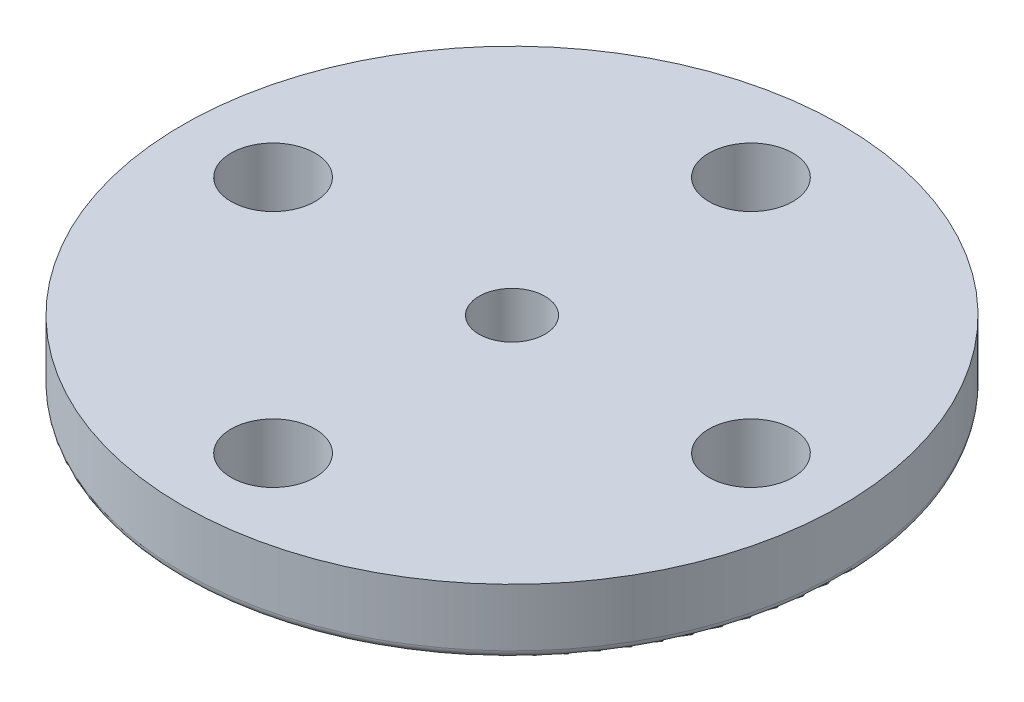
ISO-10303-21;
HEADER;
FILE_DESCRIPTION(('STEP AP214'),'2;1');
FILE_NAME('part.step','',(''),(''),'','','');
FILE_SCHEMA(('AUTOMOTIVE_DESIGN { 1 0 10303 214 1 1 1 1 }'));
ENDSEC;
DATA;
#1=APPLICATION_CONTEXT('core data for automotive mechanical design processes');
#2=APPLICATION_PROTOCOL_DEFINITION('international standard','automotive_design',2000,#1);
#3=PRODUCT_CONTEXT('',#1,'mechanical');
#4=PRODUCT('Part','Part','',(#3));
#5=PRODUCT_RELATED_PRODUCT_CATEGORY('part','',(#4));
#6=PRODUCT_DEFINITION_FORMATION('','',#4);
#7=PRODUCT_DEFINITION_CONTEXT('part definition',#1,'design');
#8=PRODUCT_DEFINITION('design','',#6,#7);
#9=PRODUCT_DEFINITION_SHAPE('','',#8);
#10=(LENGTH_UNIT() NAMED_UNIT(*) SI_UNIT(.MILLI.,.METRE.));
#11=(NAMED_UNIT(*) PLANE_ANGLE_UNIT() SI_UNIT($,.RADIAN.));
#12=(NAMED_UNIT(*) SI_UNIT($,.STERADIAN.) SOLID_ANGLE_UNIT());
#13=UNCERTAINTY_MEASURE_WITH_UNIT(LENGTH_MEASURE(1.E-05),#10,'distance_accuracy_value','');
#14=(GEOMETRIC_REPRESENTATION_CONTEXT(3) GLOBAL_UNCERTAINTY_ASSIGNED_CONTEXT((#13)) GLOBAL_UNIT_ASSIGNED_CONTEXT((#10,
#11,#12)) REPRESENTATION_CONTEXT('',''));
#15=CARTESIAN_POINT('',(0.,0.,0.));
#16=DIRECTION('',(0.,0.,1.));
#17=DIRECTION('',(1.,0.,0.));
#18=AXIS2_PLACEMENT_3D('',#15,#16,#17);
#19=CARTESIAN_POINT('',(0.,-2.5,0.));
#20=DIRECTION('',(0.,1.,0.));
#21=DIRECTION('',(0.,0.,1.));
#22=AXIS2_PLACEMENT_3D('',#19,#20,#21);
#23=CYLINDRICAL_SURFACE('',#22,1.);
#24=CARTESIAN_POINT('',(0.,2.,0.));
#25=DIRECTION('',(0.,1.,0.));
#26=DIRECTION('',(0.,0.,1.));
#27=AXIS2_PLACEMENT_3D('',#24,#25,#26);
#28=CIRCLE('',#27,1.);
#29=CARTESIAN_POINT('',(0.,2.,1.));
#30=VERTEX_POINT('',#29);
#31=EDGE_CURVE('E67',#30,#30,#28,.T.);
#32=ORIENTED_EDGE('',*,*,#31,.T.);
#33=EDGE_LOOP('',(#32));
#34=FACE_BOUND('',#33,.T.);
#35=CARTESIAN_POINT('',(0.,0.,0.));
#36=DIRECTION('',(0.,-1.,0.));
#37=DIRECTION('',(0.,0.,-1.));
#38=AXIS2_PLACEMENT_3D('',#35,#36,#37);
#39=CIRCLE('',#38,1.);
#40=CARTESIAN_POINT('',(0.,0.,-1.));
#41=VERTEX_POINT('',#40);
#42=EDGE_CURVE('E43',#41,#41,#39,.F.);
#43=ORIENTED_EDGE('',*,*,#42,.F.);
#44=EDGE_LOOP('',(#43));
#45=FACE_BOUND('',#44,.T.);
#46=ADVANCED_FACE('F39',(#34,#45),#23,.F.);
#47=CARTESIAN_POINT('',(0.,2.,0.));
#48=DIRECTION('',(0.,-1.,0.));
#49=DIRECTION('',(0.,0.,-1.));
#50=AXIS2_PLACEMENT_3D('',#47,#48,#49);
#51=CYLINDRICAL_SURFACE('',#50,10.);
#52=CARTESIAN_POINT('',(0.,0.25,0.));
#53=DIRECTION('',(0.,1.,0.));
#54=DIRECTION('',(0.,0.,1.));
#55=AXIS2_PLACEMENT_3D('',#52,#53,#54);
#56=CIRCLE('',#55,10.);
#57=CARTESIAN_POINT('',(0.,0.25,10.));
#58=VERTEX_POINT('',#57);
#59=EDGE_CURVE('E47',#58,#58,#56,.T.);
#60=ORIENTED_EDGE('',*,*,#59,.T.);
#61=EDGE_LOOP('',(#60));
#62=FACE_BOUND('',#61,.T.);
#63=CARTESIAN_POINT('',(0.,2.,0.));
#64=DIRECTION('',(0.,1.,0.));
#65=DIRECTION('',(0.,0.,1.));
#66=AXIS2_PLACEMENT_3D('',#63,#64,#65);
#67=CIRCLE('',#66,10.);
#68=CARTESIAN_POINT('',(0.,2.,10.));
#69=VERTEX_POINT('',#68);
#70=EDGE_CURVE('E51',#69,#69,#67,.T.);
#71=ORIENTED_EDGE('',*,*,#70,.F.);
#72=EDGE_LOOP('',(#71));
#73=FACE_BOUND('',#72,.T.);
#74=ADVANCED_FACE('F102',(#62,#73),#51,.T.);
#75=CARTESIAN_POINT('',(0.,2.,0.));
#76=DIRECTION('',(0.,1.,0.));
#77=DIRECTION('',(0.,0.,1.));
#78=AXIS2_PLACEMENT_3D('',#75,#76,#77);
#79=PLANE('',#78);
#80=ORIENTED_EDGE('',*,*,#31,.F.);
#81=EDGE_LOOP('',(#80));
#82=FACE_BOUND('',#81,.T.);
#83=CARTESIAN_POINT('',(0.,2.,-7.25));
#84=DIRECTION('',(0.,1.,0.));
#85=DIRECTION('',(0.,0.,1.));
#86=AXIS2_PLACEMENT_3D('',#83,#84,#85);
#87=CIRCLE('',#86,1.275);
#88=CARTESIAN_POINT('',(0.,2.,-5.975));
#89=VERTEX_POINT('',#88);
#90=EDGE_CURVE('E60',#89,#89,#87,.T.);
#91=ORIENTED_EDGE('',*,*,#90,.F.);
#92=EDGE_LOOP('',(#91));
#93=FACE_BOUND('',#92,.T.);
#94=CARTESIAN_POINT('',(-7.25,2.,0.));
#95=DIRECTION('',(0.,1.,0.));
#96=DIRECTION('',(0.,0.,1.));
#97=AXIS2_PLACEMENT_3D('',#94,#95,#96);
#98=CIRCLE('',#97,1.275);
#99=CARTESIAN_POINT('',(-7.25,2.,1.275));
#100=VERTEX_POINT('',#99);
#101=EDGE_CURVE('E79',#100,#100,#98,.T.);
#102=ORIENTED_EDGE('',*,*,#101,.F.);
#103=EDGE_LOOP('',(#102));
#104=FACE_BOUND('',#103,.T.);
#105=CARTESIAN_POINT('',(0.,2.,7.25));
#106=DIRECTION('',(0.,1.,0.));
#107=DIRECTION('',(0.,0.,-1.));
#108=AXIS2_PLACEMENT_3D('',#105,#106,#107);
#109=CIRCLE('',#108,1.275);
#110=CARTESIAN_POINT('',(0.,2.,5.975));
#111=VERTEX_POINT('',#110);
#112=EDGE_CURVE('E73',#111,#111,#109,.T.);
#113=ORIENTED_EDGE('',*,*,#112,.F.);
#114=EDGE_LOOP('',(#113));
#115=FACE_BOUND('',#114,.T.);
#116=CARTESIAN_POINT('',(7.25,2.,0.));
#117=DIRECTION('',(0.,1.,0.));
#118=DIRECTION('',(0.,0.,-1.));
#119=AXIS2_PLACEMENT_3D('',#116,#117,#118);
#120=CIRCLE('',#119,1.275);
#121=CARTESIAN_POINT('',(7.25,2.,-1.275));
#122=VERTEX_POINT('',#121);
#123=EDGE_CURVE('E66',#122,#122,#120,.T.);
#124=ORIENTED_EDGE('',*,*,#123,.F.);
#125=EDGE_LOOP('',(#124));
#126=FACE_BOUND('',#125,.T.);
#127=ORIENTED_EDGE('',*,*,#70,.T.);
#128=EDGE_LOOP('',(#127));
#129=FACE_BOUND('',#128,.T.);
#130=ADVANCED_FACE('F110',(#82,#93,#104,#115,#126,#129),#79,.T.);
#131=CARTESIAN_POINT('',(0.,0.,0.));
#132=DIRECTION('',(0.,1.,0.));
#133=DIRECTION('',(0.,0.,1.));
#134=AXIS2_PLACEMENT_3D('',#131,#132,#133);
#135=PLANE('',#134);
#136=CARTESIAN_POINT('',(0.,0.,0.));
#137=DIRECTION('',(0.,1.,0.));
#138=DIRECTION('',(0.,0.,1.));
#139=AXIS2_PLACEMENT_3D('',#136,#137,#138);
#140=CIRCLE('',#139,9.75);
#141=CARTESIAN_POINT('',(0.,0.,9.75));
#142=VERTEX_POINT('',#141);
#143=EDGE_CURVE('E10',#142,#142,#140,.F.);
#144=ORIENTED_EDGE('',*,*,#143,.T.);
#145=EDGE_LOOP('',(#144));
#146=FACE_BOUND('',#145,.T.);
#147=CARTESIAN_POINT('',(0.,0.,-7.25));
#148=DIRECTION('',(0.,1.,0.));
#149=DIRECTION('',(0.,0.,1.));
#150=AXIS2_PLACEMENT_3D('',#147,#148,#149);
#151=CIRCLE('',#150,1.275);
#152=CARTESIAN_POINT('',(0.,0.,-5.975));
#153=VERTEX_POINT('',#152);
#154=EDGE_CURVE('E82',#153,#153,#151,.T.);
#155=ORIENTED_EDGE('',*,*,#154,.T.);
#156=EDGE_LOOP('',(#155));
#157=FACE_BOUND('',#156,.T.);
#158=CARTESIAN_POINT('',(-7.25,0.,0.));
#159=DIRECTION('',(0.,1.,0.));
#160=DIRECTION('',(0.,0.,1.));
#161=AXIS2_PLACEMENT_3D('',#158,#159,#160);
#162=CIRCLE('',#161,1.275);
#163=CARTESIAN_POINT('',(-7.25,0.,1.275));
#164=VERTEX_POINT('',#163);
#165=EDGE_CURVE('E76',#164,#164,#162,.T.);
#166=ORIENTED_EDGE('',*,*,#165,.T.);
#167=EDGE_LOOP('',(#166));
#168=FACE_BOUND('',#167,.T.);
#169=CARTESIAN_POINT('',(0.,0.,7.25));
#170=DIRECTION('',(0.,1.,0.));
#171=DIRECTION('',(0.,0.,-1.));
#172=AXIS2_PLACEMENT_3D('',#169,#170,#171);
#173=CIRCLE('',#172,1.275);
#174=CARTESIAN_POINT('',(0.,0.,5.975));
#175=VERTEX_POINT('',#174);
#176=EDGE_CURVE('E70',#175,#175,#173,.T.);
#177=ORIENTED_EDGE('',*,*,#176,.T.);
#178=EDGE_LOOP('',(#177));
#179=FACE_BOUND('',#178,.T.);
#180=CARTESIAN_POINT('',(7.25,0.,0.));
#181=DIRECTION('',(0.,1.,0.));
#182=DIRECTION('',(0.,0.,-1.));
#183=AXIS2_PLACEMENT_3D('',#180,#181,#182);
#184=CIRCLE('',#183,1.275);
#185=CARTESIAN_POINT('',(7.25,0.,-1.275));
#186=VERTEX_POINT('',#185);
#187=EDGE_CURVE('E63',#186,#186,#184,.T.);
#188=ORIENTED_EDGE('',*,*,#187,.T.);
#189=EDGE_LOOP('',(#188));
#190=FACE_BOUND('',#189,.T.);
#191=CARTESIAN_POINT('',(0.,0.,0.));
#192=DIRECTION('',(0.,1.,0.));
#193=DIRECTION('',(0.,0.,1.));
#194=AXIS2_PLACEMENT_3D('',#191,#192,#193);
#195=CIRCLE('',#194,4.5);
#196=CARTESIAN_POINT('',(0.,0.,4.5));
#197=VERTEX_POINT('',#196);
#198=EDGE_CURVE('E57',#197,#197,#195,.T.);
#199=ORIENTED_EDGE('',*,*,#198,.T.);
#200=EDGE_LOOP('',(#199));
#201=FACE_BOUND('',#200,.T.);
#202=ADVANCED_FACE('F138',(#146,#157,#168,#179,#190,#201),#135,.F.);
#203=CARTESIAN_POINT('',(0.,-2.5,0.));
#204=DIRECTION('',(0.,1.,0.));
#205=DIRECTION('',(0.,0.,1.));
#206=AXIS2_PLACEMENT_3D('',#203,#204,#205);
#207=CYLINDRICAL_SURFACE('',#206,4.5);
#208=CARTESIAN_POINT('',(0.,-2.5,0.));
#209=DIRECTION('',(0.,1.,0.));
#210=DIRECTION('',(0.,0.,1.));
#211=AXIS2_PLACEMENT_3D('',#208,#209,#210);
#212=CIRCLE('',#211,4.5);
#213=CARTESIAN_POINT('',(0.,-2.5,4.5));
#214=VERTEX_POINT('',#213);
#215=EDGE_CURVE('E56',#214,#214,#212,.T.);
#216=ORIENTED_EDGE('',*,*,#215,.T.);
#217=EDGE_LOOP('',(#216));
#218=FACE_BOUND('',#217,.T.);
#219=ORIENTED_EDGE('',*,*,#198,.F.);
#220=EDGE_LOOP('',(#219));
#221=FACE_BOUND('',#220,.T.);
#222=ADVANCED_FACE('F134',(#218,#221),#207,.T.);
#223=CARTESIAN_POINT('',(0.,-2.5,0.));
#224=DIRECTION('',(0.,1.,0.));
#225=DIRECTION('',(0.,0.,1.));
#226=AXIS2_PLACEMENT_3D('',#223,#224,#225);
#227=PLANE('',#226);
#228=CARTESIAN_POINT('',(0.,-2.5,0.));
#229=DIRECTION('',(0.,-1.,0.));
#230=DIRECTION('',(0.,0.,-1.));
#231=AXIS2_PLACEMENT_3D('',#228,#229,#230);
#232=CIRCLE('',#231,2.9);
#233=CARTESIAN_POINT('',(0.,-2.5,-2.9));
#234=VERTEX_POINT('',#233);
#235=EDGE_CURVE('E89',#234,#234,#232,.T.);
#236=ORIENTED_EDGE('',*,*,#235,.F.);
#237=EDGE_LOOP('',(#236));
#238=FACE_BOUND('',#237,.T.);
#239=ORIENTED_EDGE('',*,*,#215,.F.);
#240=EDGE_LOOP('',(#239));
#241=FACE_BOUND('',#240,.T.);
#242=ADVANCED_FACE('F131',(#238,#241),#227,.F.);
#243=CARTESIAN_POINT('',(7.25,2.,0.));
#244=DIRECTION('',(0.,-1.,0.));
#245=DIRECTION('',(0.,0.,-1.));
#246=AXIS2_PLACEMENT_3D('',#243,#244,#245);
#247=CYLINDRICAL_SURFACE('',#246,1.275);
#248=ORIENTED_EDGE('',*,*,#123,.T.);
#249=EDGE_LOOP('',(#248));
#250=FACE_BOUND('',#249,.T.);
#251=ORIENTED_EDGE('',*,*,#187,.F.);
#252=EDGE_LOOP('',(#251));
#253=FACE_BOUND('',#252,.T.);
#254=ADVANCED_FACE('F127',(#250,#253),#247,.F.);
#255=CARTESIAN_POINT('',(0.,2.,7.25));
#256=DIRECTION('',(0.,-1.,0.));
#257=DIRECTION('',(0.,0.,-1.));
#258=AXIS2_PLACEMENT_3D('',#255,#256,#257);
#259=CYLINDRICAL_SURFACE('',#258,1.275);
#260=ORIENTED_EDGE('',*,*,#112,.T.);
#261=EDGE_LOOP('',(#260));
#262=FACE_BOUND('',#261,.T.);
#263=ORIENTED_EDGE('',*,*,#176,.F.);
#264=EDGE_LOOP('',(#263));
#265=FACE_BOUND('',#264,.T.);
#266=ADVANCED_FACE('F123',(#262,#265),#259,.F.);
#267=CARTESIAN_POINT('',(-7.25,2.,0.));
#268=DIRECTION('',(0.,-1.,0.));
#269=DIRECTION('',(0.,0.,-1.));
#270=AXIS2_PLACEMENT_3D('',#267,#268,#269);
#271=CYLINDRICAL_SURFACE('',#270,1.275);
#272=ORIENTED_EDGE('',*,*,#101,.T.);
#273=EDGE_LOOP('',(#272));
#274=FACE_BOUND('',#273,.T.);
#275=ORIENTED_EDGE('',*,*,#165,.F.);
#276=EDGE_LOOP('',(#275));
#277=FACE_BOUND('',#276,.T.);
#278=ADVANCED_FACE('F119',(#274,#277),#271,.F.);
#279=CARTESIAN_POINT('',(0.,2.,-7.25));
#280=DIRECTION('',(0.,-1.,0.));
#281=DIRECTION('',(0.,0.,-1.));
#282=AXIS2_PLACEMENT_3D('',#279,#280,#281);
#283=CYLINDRICAL_SURFACE('',#282,1.275);
#284=ORIENTED_EDGE('',*,*,#90,.T.);
#285=EDGE_LOOP('',(#284));
#286=FACE_BOUND('',#285,.T.);
#287=ORIENTED_EDGE('',*,*,#154,.F.);
#288=EDGE_LOOP('',(#287));
#289=FACE_BOUND('',#288,.T.);
#290=ADVANCED_FACE('F116',(#286,#289),#283,.F.);
#291=CARTESIAN_POINT('',(0.,0.25,0.));
#292=DIRECTION('',(0.,1.,0.));
#293=DIRECTION('',(0.,0.,1.));
#294=AXIS2_PLACEMENT_3D('',#291,#292,#293);
#295=TOROIDAL_SURFACE('',#294,9.75,0.25);
#296=ORIENTED_EDGE('',*,*,#143,.F.);
#297=EDGE_LOOP('',(#296));
#298=FACE_BOUND('',#297,.T.);
#299=ORIENTED_EDGE('',*,*,#59,.F.);
#300=EDGE_LOOP('',(#299));
#301=FACE_BOUND('',#300,.T.);
#302=ADVANCED_FACE('F41',(#298,#301),#295,.T.);
#303=CARTESIAN_POINT('',(0.,0.,0.));
#304=DIRECTION('',(0.,-1.,0.));
#305=DIRECTION('',(0.,0.,-1.));
#306=AXIS2_PLACEMENT_3D('',#303,#304,#305);
#307=PLANE('',#306);
#308=CARTESIAN_POINT('',(0.,0.,0.));
#309=DIRECTION('',(0.,-1.,0.));
#310=DIRECTION('',(0.,0.,-1.));
#311=AXIS2_PLACEMENT_3D('',#308,#309,#310);
#312=CIRCLE('',#311,2.9);
#313=CARTESIAN_POINT('',(0.,0.,-2.9));
#314=VERTEX_POINT('',#313);
#315=EDGE_CURVE('E92',#314,#314,#312,.T.);
#316=ORIENTED_EDGE('',*,*,#315,.T.);
#317=EDGE_LOOP('',(#316));
#318=FACE_BOUND('',#317,.T.);
#319=ORIENTED_EDGE('',*,*,#42,.T.);
#320=EDGE_LOOP('',(#319));
#321=FACE_BOUND('',#320,.T.);
#322=ADVANCED_FACE('F99',(#318,#321),#307,.T.);
#323=CARTESIAN_POINT('',(0.,0.,0.));
#324=DIRECTION('',(0.,-1.,0.));
#325=DIRECTION('',(0.,0.,-1.));
#326=AXIS2_PLACEMENT_3D('',#323,#324,#325);
#327=CYLINDRICAL_SURFACE('',#326,2.9);
#328=ORIENTED_EDGE('',*,*,#315,.F.);
#329=EDGE_LOOP('',(#328));
#330=FACE_BOUND('',#329,.T.);
#331=ORIENTED_EDGE('',*,*,#235,.T.);
#332=EDGE_LOOP('',(#331));
#333=FACE_BOUND('',#332,.T.);
#334=ADVANCED_FACE('F114',(#330,#333),#327,.F.);
#335=CLOSED_SHELL('',(#46,#74,#130,#202,#222,#242,#254,#266,#278,#290,#302,#322,#334));
#336=MANIFOLD_SOLID_BREP('B2',#335);
#337=ADVANCED_BREP_SHAPE_REPRESENTATION('',(#18,#336),#14);
#338=SHAPE_DEFINITION_REPRESENTATION(#9,#337);
ENDSEC;
END-ISO-10303-21;
